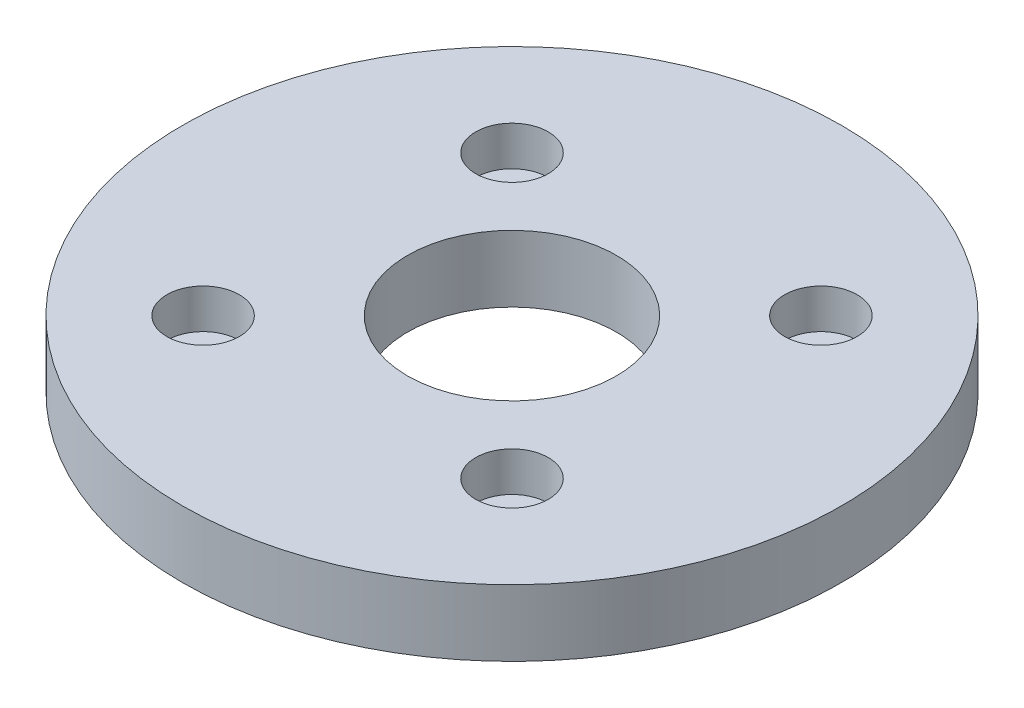
ISO-10303-21;
HEADER;
FILE_DESCRIPTION(('STEP AP214'),'2;1');
FILE_NAME('part.step','',(''),(''),'','','');
FILE_SCHEMA(('AUTOMOTIVE_DESIGN { 1 0 10303 214 1 1 1 1 }'));
ENDSEC;
DATA;
#1=APPLICATION_CONTEXT('core data for automotive mechanical design processes');
#2=APPLICATION_PROTOCOL_DEFINITION('international standard','automotive_design',2000,#1);
#3=PRODUCT_CONTEXT('',#1,'mechanical');
#4=PRODUCT('Part','Part','',(#3));
#5=PRODUCT_RELATED_PRODUCT_CATEGORY('part','',(#4));
#6=PRODUCT_DEFINITION_FORMATION('','',#4);
#7=PRODUCT_DEFINITION_CONTEXT('part definition',#1,'design');
#8=PRODUCT_DEFINITION('design','',#6,#7);
#9=PRODUCT_DEFINITION_SHAPE('','',#8);
#10=(LENGTH_UNIT() NAMED_UNIT(*) SI_UNIT(.MILLI.,.METRE.));
#11=(NAMED_UNIT(*) PLANE_ANGLE_UNIT() SI_UNIT($,.RADIAN.));
#12=(NAMED_UNIT(*) SI_UNIT($,.STERADIAN.) SOLID_ANGLE_UNIT());
#13=UNCERTAINTY_MEASURE_WITH_UNIT(LENGTH_MEASURE(1.E-05),#10,'distance_accuracy_value','');
#14=(GEOMETRIC_REPRESENTATION_CONTEXT(3) GLOBAL_UNCERTAINTY_ASSIGNED_CONTEXT((#13)) GLOBAL_UNIT_ASSIGNED_CONTEXT((#10,
#11,#12)) REPRESENTATION_CONTEXT('',''));
#15=CARTESIAN_POINT('',(0.,0.,0.));
#16=DIRECTION('',(0.,0.,1.));
#17=DIRECTION('',(1.,0.,0.));
#18=AXIS2_PLACEMENT_3D('',#15,#16,#17);
#19=CARTESIAN_POINT('',(8.13172798364529,-5.,-8.1317279836453));
#20=DIRECTION('',(0.,1.,0.));
#21=DIRECTION('',(0.,0.,1.));
#22=AXIS2_PLACEMENT_3D('',#19,#20,#21);
#23=CYLINDRICAL_SURFACE('',#22,1.);
#24=CARTESIAN_POINT('',(8.13172798364529,0.,-8.1317279836453));
#25=DIRECTION('',(0.,1.,0.));
#26=DIRECTION('',(0.,0.,1.));
#27=AXIS2_PLACEMENT_3D('',#24,#25,#26);
#28=CIRCLE('',#27,1.);
#29=CARTESIAN_POINT('',(8.13172798364529,0.,-7.13172798364529));
#30=VERTEX_POINT('',#29);
#31=EDGE_CURVE('E59',#30,#30,#28,.T.);
#32=ORIENTED_EDGE('',*,*,#31,.F.);
#33=EDGE_LOOP('',(#32));
#34=FACE_BOUND('',#33,.T.);
#35=CARTESIAN_POINT('',(8.13172798364529,1.42,-8.1317279836453));
#36=DIRECTION('',(0.,1.,0.));
#37=DIRECTION('',(0.,0.,1.));
#38=AXIS2_PLACEMENT_3D('',#35,#36,#37);
#39=CIRCLE('',#38,1.);
#40=CARTESIAN_POINT('',(8.13172798364529,1.42,-7.13172798364529));
#41=VERTEX_POINT('',#40);
#42=EDGE_CURVE('E44',#41,#41,#39,.F.);
#43=ORIENTED_EDGE('',*,*,#42,.F.);
#44=EDGE_LOOP('',(#43));
#45=FACE_BOUND('',#44,.T.);
#46=ADVANCED_FACE('F40',(#34,#45),#23,.F.);
#47=CARTESIAN_POINT('',(7.42462120245875,-5.,7.42462120245875));
#48=DIRECTION('',(0.,1.,0.));
#49=DIRECTION('',(0.,0.,1.));
#50=AXIS2_PLACEMENT_3D('',#47,#48,#49);
#51=CYLINDRICAL_SURFACE('',#50,0.999999999982254);
#52=CARTESIAN_POINT('',(7.42462120245875,0.,7.42462120245875));
#53=DIRECTION('',(0.,1.,0.));
#54=DIRECTION('',(0.,0.,1.));
#55=AXIS2_PLACEMENT_3D('',#52,#53,#54);
#56=CIRCLE('',#55,0.999999999982254);
#57=CARTESIAN_POINT('',(7.42462120245875,0.,8.424621202441));
#58=VERTEX_POINT('',#57);
#59=EDGE_CURVE('E62',#58,#58,#56,.T.);
#60=ORIENTED_EDGE('',*,*,#59,.F.);
#61=EDGE_LOOP('',(#60));
#62=FACE_BOUND('',#61,.T.);
#63=CARTESIAN_POINT('',(7.42462120245875,1.42,7.42462120245875));
#64=DIRECTION('',(0.,1.,0.));
#65=DIRECTION('',(0.,0.,1.));
#66=AXIS2_PLACEMENT_3D('',#63,#64,#65);
#67=CIRCLE('',#66,0.999999999982254);
#68=CARTESIAN_POINT('',(7.42462120245875,1.42,8.424621202441));
#69=VERTEX_POINT('',#68);
#70=EDGE_CURVE('E77',#69,#69,#67,.F.);
#71=ORIENTED_EDGE('',*,*,#70,.F.);
#72=EDGE_LOOP('',(#71));
#73=FACE_BOUND('',#72,.T.);
#74=ADVANCED_FACE('F87',(#62,#73),#51,.F.);
#75=CARTESIAN_POINT('',(-8.13172798364529,-5.,8.1317279836453));
#76=DIRECTION('',(0.,1.,0.));
#77=DIRECTION('',(0.,0.,1.));
#78=AXIS2_PLACEMENT_3D('',#75,#76,#77);
#79=CYLINDRICAL_SURFACE('',#78,1.);
#80=CARTESIAN_POINT('',(-8.13172798364529,0.,8.1317279836453));
#81=DIRECTION('',(0.,1.,0.));
#82=DIRECTION('',(0.,0.,1.));
#83=AXIS2_PLACEMENT_3D('',#80,#81,#82);
#84=CIRCLE('',#83,1.);
#85=CARTESIAN_POINT('',(-8.13172798364529,0.,9.1317279836453));
#86=VERTEX_POINT('',#85);
#87=EDGE_CURVE('E65',#86,#86,#84,.T.);
#88=ORIENTED_EDGE('',*,*,#87,.F.);
#89=EDGE_LOOP('',(#88));
#90=FACE_BOUND('',#89,.T.);
#91=CARTESIAN_POINT('',(-8.13172798364529,1.42,8.1317279836453));
#92=DIRECTION('',(0.,1.,0.));
#93=DIRECTION('',(0.,0.,1.));
#94=AXIS2_PLACEMENT_3D('',#91,#92,#93);
#95=CIRCLE('',#94,1.);
#96=CARTESIAN_POINT('',(-8.13172798364529,1.42,9.1317279836453));
#97=VERTEX_POINT('',#96);
#98=EDGE_CURVE('E74',#97,#97,#95,.F.);
#99=ORIENTED_EDGE('',*,*,#98,.F.);
#100=EDGE_LOOP('',(#99));
#101=FACE_BOUND('',#100,.T.);
#102=ADVANCED_FACE('F93',(#90,#101),#79,.F.);
#103=CARTESIAN_POINT('',(-7.42462120245874,-5.,-7.42462120245876));
#104=DIRECTION('',(0.,1.,0.));
#105=DIRECTION('',(0.,0.,1.));
#106=AXIS2_PLACEMENT_3D('',#103,#104,#105);
#107=CYLINDRICAL_SURFACE('',#106,1.);
#108=CARTESIAN_POINT('',(-7.42462120245874,0.,-7.42462120245876));
#109=DIRECTION('',(0.,1.,0.));
#110=DIRECTION('',(0.,0.,1.));
#111=AXIS2_PLACEMENT_3D('',#108,#109,#110);
#112=CIRCLE('',#111,1.);
#113=CARTESIAN_POINT('',(-7.42462120245874,0.,-6.42462120245876));
#114=VERTEX_POINT('',#113);
#115=EDGE_CURVE('E68',#114,#114,#112,.T.);
#116=ORIENTED_EDGE('',*,*,#115,.F.);
#117=EDGE_LOOP('',(#116));
#118=FACE_BOUND('',#117,.T.);
#119=CARTESIAN_POINT('',(-7.42462120245874,1.42,-7.42462120245876));
#120=DIRECTION('',(0.,1.,0.));
#121=DIRECTION('',(0.,0.,1.));
#122=AXIS2_PLACEMENT_3D('',#119,#120,#121);
#123=CIRCLE('',#122,1.);
#124=CARTESIAN_POINT('',(-7.42462120245874,1.42,-6.42462120245876));
#125=VERTEX_POINT('',#124);
#126=EDGE_CURVE('E71',#125,#125,#123,.F.);
#127=ORIENTED_EDGE('',*,*,#126,.F.);
#128=EDGE_LOOP('',(#127));
#129=FACE_BOUND('',#128,.T.);
#130=ADVANCED_FACE('F99',(#118,#129),#107,.F.);
#131=CARTESIAN_POINT('',(0.,3.5,0.));
#132=DIRECTION('',(0.,1.,0.));
#133=DIRECTION('',(0.,0.,1.));
#134=AXIS2_PLACEMENT_3D('',#131,#132,#133);
#135=PLANE('',#134);
#136=CARTESIAN_POINT('',(-8.13172798364529,3.5,8.1317279836453));
#137=DIRECTION('',(0.,1.,0.));
#138=DIRECTION('',(0.,0.,1.));
#139=AXIS2_PLACEMENT_3D('',#136,#137,#138);
#140=CIRCLE('',#139,1.91);
#141=CARTESIAN_POINT('',(-8.13172798364529,3.5,10.0417279836453));
#142=VERTEX_POINT('',#141);
#143=EDGE_CURVE('E137',#142,#142,#140,.T.);
#144=ORIENTED_EDGE('',*,*,#143,.F.);
#145=EDGE_LOOP('',(#144));
#146=FACE_BOUND('',#145,.T.);
#147=CARTESIAN_POINT('',(7.42462120245875,3.5,7.42462120245875));
#148=DIRECTION('',(0.,1.,0.));
#149=DIRECTION('',(0.,0.,1.));
#150=AXIS2_PLACEMENT_3D('',#147,#148,#149);
#151=CIRCLE('',#150,1.91);
#152=CARTESIAN_POINT('',(7.42462120245875,3.5,9.33462120245875));
#153=VERTEX_POINT('',#152);
#154=EDGE_CURVE('E143',#153,#153,#151,.T.);
#155=ORIENTED_EDGE('',*,*,#154,.F.);
#156=EDGE_LOOP('',(#155));
#157=FACE_BOUND('',#156,.T.);
#158=CARTESIAN_POINT('',(8.13172798364529,3.5,-8.1317279836453));
#159=DIRECTION('',(0.,1.,0.));
#160=DIRECTION('',(0.,0.,1.));
#161=AXIS2_PLACEMENT_3D('',#158,#159,#160);
#162=CIRCLE('',#161,1.91);
#163=CARTESIAN_POINT('',(8.13172798364529,3.5,-6.2217279836453));
#164=VERTEX_POINT('',#163);
#165=EDGE_CURVE('E149',#164,#164,#162,.T.);
#166=ORIENTED_EDGE('',*,*,#165,.F.);
#167=EDGE_LOOP('',(#166));
#168=FACE_BOUND('',#167,.T.);
#169=CARTESIAN_POINT('',(-7.42462120245874,3.5,-7.42462120245876));
#170=DIRECTION('',(0.,1.,0.));
#171=DIRECTION('',(0.,0.,1.));
#172=AXIS2_PLACEMENT_3D('',#169,#170,#171);
#173=CIRCLE('',#172,1.91);
#174=CARTESIAN_POINT('',(-7.42462120245874,3.5,-5.51462120245876));
#175=VERTEX_POINT('',#174);
#176=EDGE_CURVE('E131',#175,#175,#173,.T.);
#177=ORIENTED_EDGE('',*,*,#176,.F.);
#178=EDGE_LOOP('',(#177));
#179=FACE_BOUND('',#178,.T.);
#180=CARTESIAN_POINT('',(0.,3.5,0.));
#181=DIRECTION('',(0.,1.,0.));
#182=DIRECTION('',(0.,0.,1.));
#183=AXIS2_PLACEMENT_3D('',#180,#181,#182);
#184=CIRCLE('',#183,17.35);
#185=CARTESIAN_POINT('',(0.,3.5,17.35));
#186=VERTEX_POINT('',#185);
#187=EDGE_CURVE('E11',#186,#186,#184,.T.);
#188=ORIENTED_EDGE('',*,*,#187,.T.);
#189=EDGE_LOOP('',(#188));
#190=FACE_BOUND('',#189,.T.);
#191=CARTESIAN_POINT('',(0.,3.5,0.));
#192=DIRECTION('',(0.,1.,0.));
#193=DIRECTION('',(0.,0.,1.));
#194=AXIS2_PLACEMENT_3D('',#191,#192,#193);
#195=CIRCLE('',#194,5.5);
#196=CARTESIAN_POINT('',(0.,3.5,5.5));
#197=VERTEX_POINT('',#196);
#198=EDGE_CURVE('E53',#197,#197,#195,.T.);
#199=ORIENTED_EDGE('',*,*,#198,.F.);
#200=EDGE_LOOP('',(#199));
#201=FACE_BOUND('',#200,.T.);
#202=ADVANCED_FACE('F106',(#146,#157,#168,#179,#190,#201),#135,.T.);
#203=CARTESIAN_POINT('',(0.,0.,0.));
#204=DIRECTION('',(0.,1.,0.));
#205=DIRECTION('',(0.,0.,1.));
#206=AXIS2_PLACEMENT_3D('',#203,#204,#205);
#207=PLANE('',#206);
#208=ORIENTED_EDGE('',*,*,#115,.T.);
#209=EDGE_LOOP('',(#208));
#210=FACE_BOUND('',#209,.T.);
#211=ORIENTED_EDGE('',*,*,#87,.T.);
#212=EDGE_LOOP('',(#211));
#213=FACE_BOUND('',#212,.T.);
#214=ORIENTED_EDGE('',*,*,#59,.T.);
#215=EDGE_LOOP('',(#214));
#216=FACE_BOUND('',#215,.T.);
#217=ORIENTED_EDGE('',*,*,#31,.T.);
#218=EDGE_LOOP('',(#217));
#219=FACE_BOUND('',#218,.T.);
#220=CARTESIAN_POINT('',(0.,0.,0.));
#221=DIRECTION('',(0.,1.,0.));
#222=DIRECTION('',(0.,0.,1.));
#223=AXIS2_PLACEMENT_3D('',#220,#221,#222);
#224=CIRCLE('',#223,17.35);
#225=CARTESIAN_POINT('',(0.,0.,17.35));
#226=VERTEX_POINT('',#225);
#227=EDGE_CURVE('E48',#226,#226,#224,.T.);
#228=ORIENTED_EDGE('',*,*,#227,.F.);
#229=EDGE_LOOP('',(#228));
#230=FACE_BOUND('',#229,.T.);
#231=CARTESIAN_POINT('',(0.,0.,0.));
#232=DIRECTION('',(0.,1.,0.));
#233=DIRECTION('',(0.,0.,1.));
#234=AXIS2_PLACEMENT_3D('',#231,#232,#233);
#235=CIRCLE('',#234,5.5);
#236=CARTESIAN_POINT('',(0.,0.,5.5));
#237=VERTEX_POINT('',#236);
#238=EDGE_CURVE('E56',#237,#237,#235,.T.);
#239=ORIENTED_EDGE('',*,*,#238,.T.);
#240=EDGE_LOOP('',(#239));
#241=FACE_BOUND('',#240,.T.);
#242=ADVANCED_FACE('F108',(#210,#213,#216,#219,#230,#241),#207,.F.);
#243=CARTESIAN_POINT('',(0.,3.5,0.));
#244=DIRECTION('',(0.,-1.,0.));
#245=DIRECTION('',(0.,0.,-1.));
#246=AXIS2_PLACEMENT_3D('',#243,#244,#245);
#247=CYLINDRICAL_SURFACE('',#246,17.35);
#248=ORIENTED_EDGE('',*,*,#187,.F.);
#249=EDGE_LOOP('',(#248));
#250=FACE_BOUND('',#249,.T.);
#251=ORIENTED_EDGE('',*,*,#227,.T.);
#252=EDGE_LOOP('',(#251));
#253=FACE_BOUND('',#252,.T.);
#254=ADVANCED_FACE('F42',(#250,#253),#247,.T.);
#255=CARTESIAN_POINT('',(0.,3.5,0.));
#256=DIRECTION('',(0.,-1.,0.));
#257=DIRECTION('',(0.,0.,-1.));
#258=AXIS2_PLACEMENT_3D('',#255,#256,#257);
#259=CYLINDRICAL_SURFACE('',#258,5.5);
#260=ORIENTED_EDGE('',*,*,#198,.T.);
#261=EDGE_LOOP('',(#260));
#262=FACE_BOUND('',#261,.T.);
#263=ORIENTED_EDGE('',*,*,#238,.F.);
#264=EDGE_LOOP('',(#263));
#265=FACE_BOUND('',#264,.T.);
#266=ADVANCED_FACE('F101',(#262,#265),#259,.F.);
#267=CARTESIAN_POINT('',(-7.42462120245874,1.42,-7.42462120245876));
#268=DIRECTION('',(0.,1.,0.));
#269=DIRECTION('',(0.,0.,1.));
#270=AXIS2_PLACEMENT_3D('',#267,#268,#269);
#271=PLANE('',#270);
#272=CARTESIAN_POINT('',(-7.42462120245874,1.42,-7.42462120245876));
#273=DIRECTION('',(0.,1.,0.));
#274=DIRECTION('',(0.,0.,1.));
#275=AXIS2_PLACEMENT_3D('',#272,#273,#274);
#276=CIRCLE('',#275,1.91);
#277=CARTESIAN_POINT('',(-7.42462120245874,1.42,-5.51462120245876));
#278=VERTEX_POINT('',#277);
#279=EDGE_CURVE('E75',#278,#278,#276,.T.);
#280=ORIENTED_EDGE('',*,*,#279,.T.);
#281=EDGE_LOOP('',(#280));
#282=FACE_BOUND('',#281,.T.);
#283=ORIENTED_EDGE('',*,*,#126,.T.);
#284=EDGE_LOOP('',(#283));
#285=FACE_BOUND('',#284,.T.);
#286=ADVANCED_FACE('F104',(#282,#285),#271,.T.);
#287=CARTESIAN_POINT('',(-7.42462120245874,1.42,-7.42462120245876));
#288=DIRECTION('',(0.,1.,0.));
#289=DIRECTION('',(0.,0.,1.));
#290=AXIS2_PLACEMENT_3D('',#287,#288,#289);
#291=CYLINDRICAL_SURFACE('',#290,1.91);
#292=ORIENTED_EDGE('',*,*,#279,.F.);
#293=EDGE_LOOP('',(#292));
#294=FACE_BOUND('',#293,.T.);
#295=ORIENTED_EDGE('',*,*,#176,.T.);
#296=EDGE_LOOP('',(#295));
#297=FACE_BOUND('',#296,.T.);
#298=ADVANCED_FACE('F166',(#294,#297),#291,.F.);
#299=CARTESIAN_POINT('',(-8.13172798364529,1.42,8.1317279836453));
#300=DIRECTION('',(0.,1.,0.));
#301=DIRECTION('',(0.,0.,1.));
#302=AXIS2_PLACEMENT_3D('',#299,#300,#301);
#303=PLANE('',#302);
#304=CARTESIAN_POINT('',(-8.13172798364529,1.42,8.1317279836453));
#305=DIRECTION('',(0.,1.,0.));
#306=DIRECTION('',(0.,0.,1.));
#307=AXIS2_PLACEMENT_3D('',#304,#305,#306);
#308=CIRCLE('',#307,1.91);
#309=CARTESIAN_POINT('',(-8.13172798364529,1.42,10.0417279836453));
#310=VERTEX_POINT('',#309);
#311=EDGE_CURVE('E140',#310,#310,#308,.T.);
#312=ORIENTED_EDGE('',*,*,#311,.T.);
#313=EDGE_LOOP('',(#312));
#314=FACE_BOUND('',#313,.T.);
#315=ORIENTED_EDGE('',*,*,#98,.T.);
#316=EDGE_LOOP('',(#315));
#317=FACE_BOUND('',#316,.T.);
#318=ADVANCED_FACE('F168',(#314,#317),#303,.T.);
#319=CARTESIAN_POINT('',(-8.13172798364529,1.42,8.1317279836453));
#320=DIRECTION('',(0.,1.,0.));
#321=DIRECTION('',(0.,0.,1.));
#322=AXIS2_PLACEMENT_3D('',#319,#320,#321);
#323=CYLINDRICAL_SURFACE('',#322,1.91);
#324=ORIENTED_EDGE('',*,*,#311,.F.);
#325=EDGE_LOOP('',(#324));
#326=FACE_BOUND('',#325,.T.);
#327=ORIENTED_EDGE('',*,*,#143,.T.);
#328=EDGE_LOOP('',(#327));
#329=FACE_BOUND('',#328,.T.);
#330=ADVANCED_FACE('F175',(#326,#329),#323,.F.);
#331=CARTESIAN_POINT('',(7.42462120245875,1.42,7.42462120245875));
#332=DIRECTION('',(0.,1.,0.));
#333=DIRECTION('',(0.,0.,1.));
#334=AXIS2_PLACEMENT_3D('',#331,#332,#333);
#335=PLANE('',#334);
#336=CARTESIAN_POINT('',(7.42462120245875,1.42,7.42462120245875));
#337=DIRECTION('',(0.,1.,0.));
#338=DIRECTION('',(0.,0.,1.));
#339=AXIS2_PLACEMENT_3D('',#336,#337,#338);
#340=CIRCLE('',#339,1.91);
#341=CARTESIAN_POINT('',(7.42462120245875,1.42,9.33462120245875));
#342=VERTEX_POINT('',#341);
#343=EDGE_CURVE('E146',#342,#342,#340,.T.);
#344=ORIENTED_EDGE('',*,*,#343,.T.);
#345=EDGE_LOOP('',(#344));
#346=FACE_BOUND('',#345,.T.);
#347=ORIENTED_EDGE('',*,*,#70,.T.);
#348=EDGE_LOOP('',(#347));
#349=FACE_BOUND('',#348,.T.);
#350=ADVANCED_FACE('F227',(#346,#349),#335,.T.);
#351=CARTESIAN_POINT('',(7.42462120245875,1.42,7.42462120245875));
#352=DIRECTION('',(0.,1.,0.));
#353=DIRECTION('',(0.,0.,1.));
#354=AXIS2_PLACEMENT_3D('',#351,#352,#353);
#355=CYLINDRICAL_SURFACE('',#354,1.91);
#356=ORIENTED_EDGE('',*,*,#343,.F.);
#357=EDGE_LOOP('',(#356));
#358=FACE_BOUND('',#357,.T.);
#359=ORIENTED_EDGE('',*,*,#154,.T.);
#360=EDGE_LOOP('',(#359));
#361=FACE_BOUND('',#360,.T.);
#362=ADVANCED_FACE('F236',(#358,#361),#355,.F.);
#363=CARTESIAN_POINT('',(8.13172798364529,1.42,-8.1317279836453));
#364=DIRECTION('',(0.,1.,0.));
#365=DIRECTION('',(0.,0.,1.));
#366=AXIS2_PLACEMENT_3D('',#363,#364,#365);
#367=PLANE('',#366);
#368=CARTESIAN_POINT('',(8.13172798364529,1.42,-8.1317279836453));
#369=DIRECTION('',(0.,1.,0.));
#370=DIRECTION('',(0.,0.,1.));
#371=AXIS2_PLACEMENT_3D('',#368,#369,#370);
#372=CIRCLE('',#371,1.91);
#373=CARTESIAN_POINT('',(8.13172798364529,1.42,-6.2217279836453));
#374=VERTEX_POINT('',#373);
#375=EDGE_CURVE('E134',#374,#374,#372,.T.);
#376=ORIENTED_EDGE('',*,*,#375,.T.);
#377=EDGE_LOOP('',(#376));
#378=FACE_BOUND('',#377,.T.);
#379=ORIENTED_EDGE('',*,*,#42,.T.);
#380=EDGE_LOOP('',(#379));
#381=FACE_BOUND('',#380,.T.);
#382=ADVANCED_FACE('F84',(#378,#381),#367,.T.);
#383=CARTESIAN_POINT('',(8.13172798364529,1.42,-8.1317279836453));
#384=DIRECTION('',(0.,1.,0.));
#385=DIRECTION('',(0.,0.,1.));
#386=AXIS2_PLACEMENT_3D('',#383,#384,#385);
#387=CYLINDRICAL_SURFACE('',#386,1.91);
#388=ORIENTED_EDGE('',*,*,#375,.F.);
#389=EDGE_LOOP('',(#388));
#390=FACE_BOUND('',#389,.T.);
#391=ORIENTED_EDGE('',*,*,#165,.T.);
#392=EDGE_LOOP('',(#391));
#393=FACE_BOUND('',#392,.T.);
#394=ADVANCED_FACE('F156',(#390,#393),#387,.F.);
#395=CLOSED_SHELL('',(#46,#74,#102,#130,#202,#242,#254,#266,#286,#298,#318,#330,#350,#362,#382,#394));
#396=MANIFOLD_SOLID_BREP('B2',#395);
#397=ADVANCED_BREP_SHAPE_REPRESENTATION('',(#18,#396),#14);
#398=SHAPE_DEFINITION_REPRESENTATION(#9,#397);
ENDSEC;
END-ISO-10303-21;
